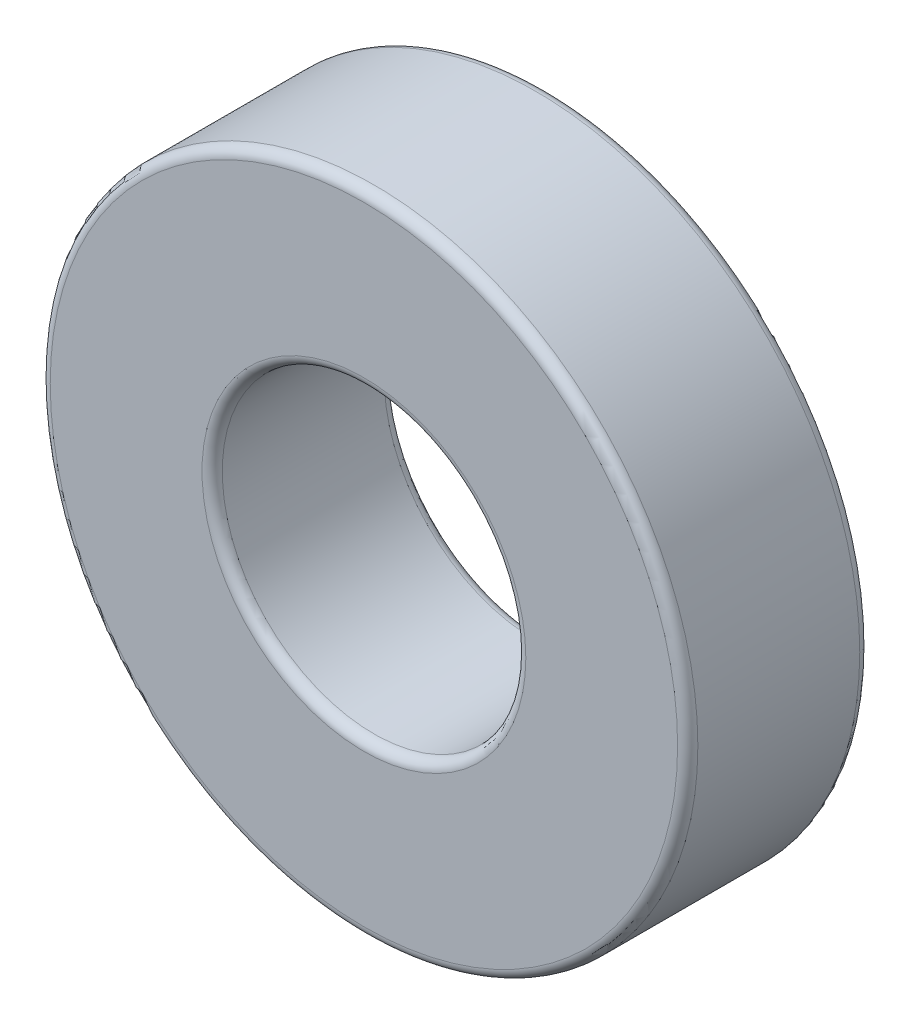
ISO-10303-21;
HEADER;
FILE_DESCRIPTION(('STEP AP214'),'2;1');
FILE_NAME('part.step','',(''),(''),'','','');
FILE_SCHEMA(('AUTOMOTIVE_DESIGN { 1 0 10303 214 1 1 1 1 }'));
ENDSEC;
DATA;
#1=APPLICATION_CONTEXT('core data for automotive mechanical design processes');
#2=APPLICATION_PROTOCOL_DEFINITION('international standard','automotive_design',2000,#1);
#3=PRODUCT_CONTEXT('',#1,'mechanical');
#4=PRODUCT('Part','Part','',(#3));
#5=PRODUCT_RELATED_PRODUCT_CATEGORY('part','',(#4));
#6=PRODUCT_DEFINITION_FORMATION('','',#4);
#7=PRODUCT_DEFINITION_CONTEXT('part definition',#1,'design');
#8=PRODUCT_DEFINITION('design','',#6,#7);
#9=PRODUCT_DEFINITION_SHAPE('','',#8);
#10=(LENGTH_UNIT() NAMED_UNIT(*) SI_UNIT(.MILLI.,.METRE.));
#11=(NAMED_UNIT(*) PLANE_ANGLE_UNIT() SI_UNIT($,.RADIAN.));
#12=(NAMED_UNIT(*) SI_UNIT($,.STERADIAN.) SOLID_ANGLE_UNIT());
#13=UNCERTAINTY_MEASURE_WITH_UNIT(LENGTH_MEASURE(1.E-05),#10,'distance_accuracy_value','');
#14=(GEOMETRIC_REPRESENTATION_CONTEXT(3) GLOBAL_UNCERTAINTY_ASSIGNED_CONTEXT((#13)) GLOBAL_UNIT_ASSIGNED_CONTEXT((#10,
#11,#12)) REPRESENTATION_CONTEXT('',''));
#15=CARTESIAN_POINT('',(0.,0.,0.));
#16=DIRECTION('',(0.,0.,1.));
#17=DIRECTION('',(1.,0.,0.));
#18=AXIS2_PLACEMENT_3D('',#15,#16,#17);
#19=CARTESIAN_POINT('',(4.44089209850063E-13,4.44089209850063E-13,8.9999999999999));
#20=DIRECTION('',(0.,0.,1.));
#21=DIRECTION('',(0.999999999999999,0.,0.));
#22=AXIS2_PLACEMENT_3D('',#19,#20,#21);
#23=PLANE('',#22);
#24=CARTESIAN_POINT('',(4.44089209850063E-13,4.44089209850063E-13,8.9999999999999));
#25=DIRECTION('',(0.,0.,1.));
#26=DIRECTION('',(0.999999999999999,0.,0.));
#27=AXIS2_PLACEMENT_3D('',#24,#25,#26);
#28=CIRCLE('',#27,15.5);
#29=CARTESIAN_POINT('',(15.5000000000004,4.46885584093337E-13,8.9999999999999));
#30=VERTEX_POINT('',#29);
#31=EDGE_CURVE('E39',#30,#30,#28,.T.);
#32=ORIENTED_EDGE('',*,*,#31,.T.);
#33=EDGE_LOOP('',(#32));
#34=FACE_BOUND('',#33,.T.);
#35=CARTESIAN_POINT('',(4.44089209850063E-13,4.44089209850063E-13,8.9999999999999));
#36=DIRECTION('',(0.,0.,1.));
#37=DIRECTION('',(0.999999999999999,0.,0.));
#38=AXIS2_PLACEMENT_3D('',#35,#36,#37);
#39=CIRCLE('',#38,8.);
#40=CARTESIAN_POINT('',(8.00000000000044,4.45532499782075E-13,8.9999999999999));
#41=VERTEX_POINT('',#40);
#42=EDGE_CURVE('E43',#41,#41,#39,.F.);
#43=ORIENTED_EDGE('',*,*,#42,.T.);
#44=EDGE_LOOP('',(#43));
#45=FACE_BOUND('',#44,.T.);
#46=ADVANCED_FACE('F28',(#34,#45),#23,.T.);
#47=CARTESIAN_POINT('',(0.,0.,0.));
#48=DIRECTION('',(0.,0.,1.));
#49=DIRECTION('',(0.999999999999999,0.,0.));
#50=AXIS2_PLACEMENT_3D('',#47,#48,#49);
#51=PLANE('',#50);
#52=CARTESIAN_POINT('',(0.,0.,0.));
#53=DIRECTION('',(0.,0.,1.));
#54=DIRECTION('',(0.999999999999999,0.,0.));
#55=AXIS2_PLACEMENT_3D('',#52,#53,#54);
#56=CIRCLE('',#55,15.5);
#57=CARTESIAN_POINT('',(15.5,0.,0.));
#58=VERTEX_POINT('',#57);
#59=EDGE_CURVE('E48',#58,#58,#56,.F.);
#60=ORIENTED_EDGE('',*,*,#59,.T.);
#61=EDGE_LOOP('',(#60));
#62=FACE_BOUND('',#61,.T.);
#63=CARTESIAN_POINT('',(0.,0.,0.));
#64=DIRECTION('',(0.,0.,1.));
#65=DIRECTION('',(0.999999999999999,0.,0.));
#66=AXIS2_PLACEMENT_3D('',#63,#64,#65);
#67=CIRCLE('',#66,8.);
#68=CARTESIAN_POINT('',(7.99999999999999,0.,0.));
#69=VERTEX_POINT('',#68);
#70=EDGE_CURVE('E51',#69,#69,#67,.T.);
#71=ORIENTED_EDGE('',*,*,#70,.T.);
#72=EDGE_LOOP('',(#71));
#73=FACE_BOUND('',#72,.T.);
#74=ADVANCED_FACE('F73',(#62,#73),#51,.F.);
#75=CARTESIAN_POINT('',(4.44089209850063E-13,4.44089209850063E-13,8.9999999999999));
#76=DIRECTION('',(0.,0.,-1.));
#77=DIRECTION('',(-0.999999999999999,0.,0.));
#78=AXIS2_PLACEMENT_3D('',#75,#76,#77);
#79=CYLINDRICAL_SURFACE('',#78,16.);
#80=CARTESIAN_POINT('',(3.33066907387547E-13,4.44089209850063E-13,0.499999999999889));
#81=DIRECTION('',(0.,0.,1.));
#82=DIRECTION('',(0.999999999999999,0.,0.));
#83=AXIS2_PLACEMENT_3D('',#80,#81,#82);
#84=CIRCLE('',#83,16.);
#85=CARTESIAN_POINT('',(16.0000000000003,4.46975789714088E-13,0.499999999999894));
#86=VERTEX_POINT('',#85);
#87=EDGE_CURVE('E54',#86,#86,#84,.T.);
#88=ORIENTED_EDGE('',*,*,#87,.T.);
#89=EDGE_LOOP('',(#88));
#90=FACE_BOUND('',#89,.T.);
#91=CARTESIAN_POINT('',(1.11022302462516E-13,2.22044604925031E-13,8.49999999999984));
#92=DIRECTION('',(0.,0.,1.));
#93=DIRECTION('',(0.999999999999999,0.,0.));
#94=AXIS2_PLACEMENT_3D('',#91,#92,#93);
#95=CIRCLE('',#94,16.);
#96=CARTESIAN_POINT('',(16.0000000000001,2.24931184789057E-13,8.49999999999985));
#97=VERTEX_POINT('',#96);
#98=EDGE_CURVE('E57',#97,#97,#95,.F.);
#99=ORIENTED_EDGE('',*,*,#98,.T.);
#100=EDGE_LOOP('',(#99));
#101=FACE_BOUND('',#100,.T.);
#102=ADVANCED_FACE('F61',(#90,#101),#79,.T.);
#103=CARTESIAN_POINT('',(4.44089209850063E-13,4.44089209850063E-13,8.9999999999999));
#104=DIRECTION('',(0.,0.,-1.));
#105=DIRECTION('',(-0.999999999999999,0.,0.));
#106=AXIS2_PLACEMENT_3D('',#103,#104,#105);
#107=CYLINDRICAL_SURFACE('',#106,7.5);
#108=CARTESIAN_POINT('',(1.11022302462516E-13,2.22044604925031E-13,8.49999999999984));
#109=DIRECTION('',(0.,0.,1.));
#110=DIRECTION('',(0.999999999999999,0.,0.));
#111=AXIS2_PLACEMENT_3D('',#108,#109,#110);
#112=CIRCLE('',#111,7.5);
#113=CARTESIAN_POINT('',(7.5000000000001,2.23397689236293E-13,8.49999999999984));
#114=VERTEX_POINT('',#113);
#115=EDGE_CURVE('E10',#114,#114,#112,.T.);
#116=ORIENTED_EDGE('',*,*,#115,.T.);
#117=EDGE_LOOP('',(#116));
#118=FACE_BOUND('',#117,.T.);
#119=CARTESIAN_POINT('',(3.33066907387547E-13,4.44089209850063E-13,0.499999999999889));
#120=DIRECTION('',(0.,0.,1.));
#121=DIRECTION('',(0.999999999999999,0.,0.));
#122=AXIS2_PLACEMENT_3D('',#119,#120,#121);
#123=CIRCLE('',#122,7.5);
#124=CARTESIAN_POINT('',(7.50000000000033,4.45442294161324E-13,0.499999999999891));
#125=VERTEX_POINT('',#124);
#126=EDGE_CURVE('E35',#125,#125,#123,.F.);
#127=ORIENTED_EDGE('',*,*,#126,.T.);
#128=EDGE_LOOP('',(#127));
#129=FACE_BOUND('',#128,.T.);
#130=ADVANCED_FACE('F86',(#118,#129),#107,.F.);
#131=CARTESIAN_POINT('',(3.33066907387547E-13,4.44089209850063E-13,0.499999999999889));
#132=DIRECTION('',(0.,0.,1.));
#133=DIRECTION('',(0.999999999999999,0.,0.));
#134=AXIS2_PLACEMENT_3D('',#131,#132,#133);
#135=TOROIDAL_SURFACE('',#134,15.5,0.5);
#136=ORIENTED_EDGE('',*,*,#59,.F.);
#137=EDGE_LOOP('',(#136));
#138=FACE_BOUND('',#137,.T.);
#139=ORIENTED_EDGE('',*,*,#87,.F.);
#140=EDGE_LOOP('',(#139));
#141=FACE_BOUND('',#140,.T.);
#142=ADVANCED_FACE('F67',(#138,#141),#135,.T.);
#143=CARTESIAN_POINT('',(1.11022302462516E-13,2.22044604925031E-13,8.49999999999984));
#144=DIRECTION('',(0.,0.,1.));
#145=DIRECTION('',(0.999999999999999,0.,0.));
#146=AXIS2_PLACEMENT_3D('',#143,#144,#145);
#147=TOROIDAL_SURFACE('',#146,15.5,0.5);
#148=ORIENTED_EDGE('',*,*,#98,.F.);
#149=EDGE_LOOP('',(#148));
#150=FACE_BOUND('',#149,.T.);
#151=ORIENTED_EDGE('',*,*,#31,.F.);
#152=EDGE_LOOP('',(#151));
#153=FACE_BOUND('',#152,.T.);
#154=ADVANCED_FACE('F63',(#150,#153),#147,.T.);
#155=CARTESIAN_POINT('',(1.11022302462516E-13,2.22044604925031E-13,8.49999999999984));
#156=DIRECTION('',(0.,0.,1.));
#157=DIRECTION('',(0.999999999999999,0.,0.));
#158=AXIS2_PLACEMENT_3D('',#155,#156,#157);
#159=TOROIDAL_SURFACE('',#158,8.,0.5);
#160=ORIENTED_EDGE('',*,*,#42,.F.);
#161=EDGE_LOOP('',(#160));
#162=FACE_BOUND('',#161,.T.);
#163=ORIENTED_EDGE('',*,*,#115,.F.);
#164=EDGE_LOOP('',(#163));
#165=FACE_BOUND('',#164,.T.);
#166=ADVANCED_FACE('F66',(#162,#165),#159,.T.);
#167=CARTESIAN_POINT('',(3.33066907387547E-13,4.44089209850063E-13,0.499999999999889));
#168=DIRECTION('',(0.,0.,1.));
#169=DIRECTION('',(0.999999999999999,0.,0.));
#170=AXIS2_PLACEMENT_3D('',#167,#168,#169);
#171=TOROIDAL_SURFACE('',#170,8.,0.5);
#172=ORIENTED_EDGE('',*,*,#126,.F.);
#173=EDGE_LOOP('',(#172));
#174=FACE_BOUND('',#173,.T.);
#175=ORIENTED_EDGE('',*,*,#70,.F.);
#176=EDGE_LOOP('',(#175));
#177=FACE_BOUND('',#176,.T.);
#178=ADVANCED_FACE('F30',(#174,#177),#171,.T.);
#179=CLOSED_SHELL('',(#46,#74,#102,#130,#142,#154,#166,#178));
#180=MANIFOLD_SOLID_BREP('B2',#179);
#181=ADVANCED_BREP_SHAPE_REPRESENTATION('',(#18,#180),#14);
#182=SHAPE_DEFINITION_REPRESENTATION(#9,#181);
ENDSEC;
END-ISO-10303-21;
